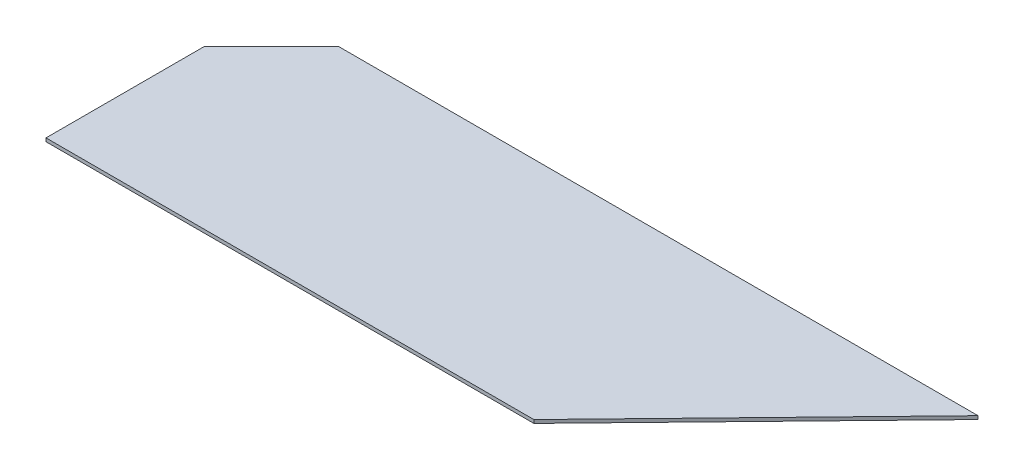
ISO-10303-21;
HEADER;
FILE_DESCRIPTION(('STEP AP214'),'2;1');
FILE_NAME('part.step','',(''),(''),'','','');
FILE_SCHEMA(('AUTOMOTIVE_DESIGN { 1 0 10303 214 1 1 1 1 }'));
ENDSEC;
DATA;
#1=APPLICATION_CONTEXT('core data for automotive mechanical design processes');
#2=APPLICATION_PROTOCOL_DEFINITION('international standard','automotive_design',2000,#1);
#3=PRODUCT_CONTEXT('',#1,'mechanical');
#4=PRODUCT('Part','Part','',(#3));
#5=PRODUCT_RELATED_PRODUCT_CATEGORY('part','',(#4));
#6=PRODUCT_DEFINITION_FORMATION('','',#4);
#7=PRODUCT_DEFINITION_CONTEXT('part definition',#1,'design');
#8=PRODUCT_DEFINITION('design','',#6,#7);
#9=PRODUCT_DEFINITION_SHAPE('','',#8);
#10=(LENGTH_UNIT() NAMED_UNIT(*) SI_UNIT(.MILLI.,.METRE.));
#11=(NAMED_UNIT(*) PLANE_ANGLE_UNIT() SI_UNIT($,.RADIAN.));
#12=(NAMED_UNIT(*) SI_UNIT($,.STERADIAN.) SOLID_ANGLE_UNIT());
#13=UNCERTAINTY_MEASURE_WITH_UNIT(LENGTH_MEASURE(1.E-05),#10,'distance_accuracy_value','');
#14=(GEOMETRIC_REPRESENTATION_CONTEXT(3) GLOBAL_UNCERTAINTY_ASSIGNED_CONTEXT((#13)) GLOBAL_UNIT_ASSIGNED_CONTEXT((#10,
#11,#12)) REPRESENTATION_CONTEXT('',''));
#15=CARTESIAN_POINT('',(0.,0.,0.));
#16=DIRECTION('',(0.,0.,1.));
#17=DIRECTION('',(1.,0.,0.));
#18=AXIS2_PLACEMENT_3D('',#15,#16,#17);
#19=CARTESIAN_POINT('',(-23.2086223984143,0.5,19.3808225966303));
#20=DIRECTION('',(1.,0.,0.));
#21=DIRECTION('',(0.,0.,-1.));
#22=AXIS2_PLACEMENT_3D('',#19,#20,#21);
#23=PLANE('',#22);
#24=DIRECTION('',(0.,0.,1.));
#25=VECTOR('',#24,1.);
#26=CARTESIAN_POINT('',(-23.2086223984143,0.,19.3808225966303));
#27=LINE('',#26,#25);
#28=CARTESIAN_POINT('',(-23.2086223984143,0.,-4.11917740336967));
#29=VERTEX_POINT('',#28);
#30=CARTESIAN_POINT('',(-23.2086223984143,0.,19.3808225966303));
#31=VERTEX_POINT('',#30);
#32=EDGE_CURVE('E109',#29,#31,#27,.T.);
#33=ORIENTED_EDGE('',*,*,#32,.T.);
#34=DIRECTION('',(0.,-1.,0.));
#35=VECTOR('',#34,1.);
#36=CARTESIAN_POINT('',(-23.2086223984143,0.5,19.3808225966303));
#37=LINE('',#36,#35);
#38=CARTESIAN_POINT('',(-23.2086223984143,0.5,19.3808225966303));
#39=VERTEX_POINT('',#38);
#40=EDGE_CURVE('E11',#39,#31,#37,.T.);
#41=ORIENTED_EDGE('',*,*,#40,.F.);
#42=DIRECTION('',(0.,0.,1.));
#43=VECTOR('',#42,1.);
#44=CARTESIAN_POINT('',(-23.2086223984143,0.5,19.3808225966303));
#45=LINE('',#44,#43);
#46=CARTESIAN_POINT('',(-23.2086223984143,0.5,-4.11917740336967));
#47=VERTEX_POINT('',#46);
#48=EDGE_CURVE('E117',#47,#39,#45,.T.);
#49=ORIENTED_EDGE('',*,*,#48,.F.);
#50=DIRECTION('',(0.,-1.,0.));
#51=VECTOR('',#50,1.);
#52=CARTESIAN_POINT('',(-23.2086223984143,0.5,-4.11917740336967));
#53=LINE('',#52,#51);
#54=EDGE_CURVE('E105',#47,#29,#53,.T.);
#55=ORIENTED_EDGE('',*,*,#54,.T.);
#56=EDGE_LOOP('',(#33,#41,#49,#55));
#57=FACE_BOUND('',#56,.T.);
#58=ADVANCED_FACE('F35',(#57),#23,.F.);
#59=CARTESIAN_POINT('',(-23.2086223984143,0.5,19.3808225966303));
#60=DIRECTION('',(0.,0.,-1.));
#61=DIRECTION('',(-1.,0.,0.));
#62=AXIS2_PLACEMENT_3D('',#59,#60,#61);
#63=PLANE('',#62);
#64=DIRECTION('',(1.,0.,0.));
#65=VECTOR('',#64,1.);
#66=CARTESIAN_POINT('',(-23.2086223984143,0.,19.3808225966303));
#67=LINE('',#66,#65);
#68=CARTESIAN_POINT('',(49.2913776015857,0.,19.3808225966303));
#69=VERTEX_POINT('',#68);
#70=EDGE_CURVE('E112',#31,#69,#67,.T.);
#71=ORIENTED_EDGE('',*,*,#70,.T.);
#72=DIRECTION('',(0.,-1.,0.));
#73=VECTOR('',#72,1.);
#74=CARTESIAN_POINT('',(49.2913776015857,0.5,19.3808225966303));
#75=LINE('',#74,#73);
#76=CARTESIAN_POINT('',(49.2913776015857,0.5,19.3808225966303));
#77=VERTEX_POINT('',#76);
#78=EDGE_CURVE('E43',#77,#69,#75,.T.);
#79=ORIENTED_EDGE('',*,*,#78,.F.);
#80=DIRECTION('',(1.,0.,0.));
#81=VECTOR('',#80,1.);
#82=CARTESIAN_POINT('',(-23.2086223984143,0.5,19.3808225966303));
#83=LINE('',#82,#81);
#84=EDGE_CURVE('E85',#39,#77,#83,.T.);
#85=ORIENTED_EDGE('',*,*,#84,.F.);
#86=ORIENTED_EDGE('',*,*,#40,.T.);
#87=EDGE_LOOP('',(#71,#79,#85,#86));
#88=FACE_BOUND('',#87,.T.);
#89=ADVANCED_FACE('F136',(#88),#63,.F.);
#90=CARTESIAN_POINT('',(49.2913776015857,0.5,19.3808225966303));
#91=DIRECTION('',(-0.717738140020842,0.,-0.696313120915743));
#92=DIRECTION('',(-0.696313120915743,0.,0.717738140020842));
#93=AXIS2_PLACEMENT_3D('',#90,#91,#92);
#94=PLANE('',#93);
#95=DIRECTION('',(0.696313120915743,0.,-0.717738140020842));
#96=VECTOR('',#95,1.);
#97=CARTESIAN_POINT('',(49.2913776015857,0.,19.3808225966303));
#98=LINE('',#97,#96);
#99=CARTESIAN_POINT('',(81.7913776015857,0.,-14.1191774033697));
#100=VERTEX_POINT('',#99);
#101=EDGE_CURVE('E100',#69,#100,#98,.T.);
#102=ORIENTED_EDGE('',*,*,#101,.T.);
#103=DIRECTION('',(0.,-1.,0.));
#104=VECTOR('',#103,1.);
#105=CARTESIAN_POINT('',(81.7913776015857,0.5,-14.1191774033697));
#106=LINE('',#105,#104);
#107=CARTESIAN_POINT('',(81.7913776015857,0.5,-14.1191774033697));
#108=VERTEX_POINT('',#107);
#109=EDGE_CURVE('E97',#108,#100,#106,.T.);
#110=ORIENTED_EDGE('',*,*,#109,.F.);
#111=DIRECTION('',(0.696313120915743,0.,-0.717738140020842));
#112=VECTOR('',#111,1.);
#113=CARTESIAN_POINT('',(49.2913776015857,0.5,19.3808225966303));
#114=LINE('',#113,#112);
#115=EDGE_CURVE('E89',#77,#108,#114,.T.);
#116=ORIENTED_EDGE('',*,*,#115,.F.);
#117=ORIENTED_EDGE('',*,*,#78,.T.);
#118=EDGE_LOOP('',(#102,#110,#116,#117));
#119=FACE_BOUND('',#118,.T.);
#120=ADVANCED_FACE('F98',(#119),#94,.F.);
#121=CARTESIAN_POINT('',(-13.2086223984143,0.5,-14.1191774033697));
#122=DIRECTION('',(0.,0.,1.));
#123=DIRECTION('',(1.,0.,0.));
#124=AXIS2_PLACEMENT_3D('',#121,#122,#123);
#125=PLANE('',#124);
#126=DIRECTION('',(-1.,0.,0.));
#127=VECTOR('',#126,1.);
#128=CARTESIAN_POINT('',(-13.2086223984143,0.,-14.1191774033697));
#129=LINE('',#128,#127);
#130=CARTESIAN_POINT('',(-13.2086223984143,0.,-14.1191774033697));
#131=VERTEX_POINT('',#130);
#132=EDGE_CURVE('E71',#100,#131,#129,.T.);
#133=ORIENTED_EDGE('',*,*,#132,.T.);
#134=DIRECTION('',(0.,-1.,0.));
#135=VECTOR('',#134,1.);
#136=CARTESIAN_POINT('',(-13.2086223984143,0.5,-14.1191774033697));
#137=LINE('',#136,#135);
#138=CARTESIAN_POINT('',(-13.2086223984143,0.5,-14.1191774033697));
#139=VERTEX_POINT('',#138);
#140=EDGE_CURVE('E101',#139,#131,#137,.T.);
#141=ORIENTED_EDGE('',*,*,#140,.F.);
#142=DIRECTION('',(-1.,0.,0.));
#143=VECTOR('',#142,1.);
#144=CARTESIAN_POINT('',(-13.2086223984143,0.5,-14.1191774033697));
#145=LINE('',#144,#143);
#146=EDGE_CURVE('E93',#108,#139,#145,.T.);
#147=ORIENTED_EDGE('',*,*,#146,.F.);
#148=ORIENTED_EDGE('',*,*,#109,.T.);
#149=EDGE_LOOP('',(#133,#141,#147,#148));
#150=FACE_BOUND('',#149,.T.);
#151=ADVANCED_FACE('F103',(#150),#125,.F.);
#152=CARTESIAN_POINT('',(-23.2086223984143,0.5,-4.11917740336967));
#153=DIRECTION('',(0.707106781186548,0.,0.707106781186547));
#154=DIRECTION('',(0.707106781186547,0.,-0.707106781186548));
#155=AXIS2_PLACEMENT_3D('',#152,#153,#154);
#156=PLANE('',#155);
#157=DIRECTION('',(-0.707106781186547,0.,0.707106781186548));
#158=VECTOR('',#157,1.);
#159=CARTESIAN_POINT('',(-23.2086223984143,0.,-4.11917740336967));
#160=LINE('',#159,#158);
#161=EDGE_CURVE('E77',#131,#29,#160,.T.);
#162=ORIENTED_EDGE('',*,*,#161,.T.);
#163=ORIENTED_EDGE('',*,*,#54,.F.);
#164=DIRECTION('',(-0.707106781186547,0.,0.707106781186548));
#165=VECTOR('',#164,1.);
#166=CARTESIAN_POINT('',(-23.2086223984143,0.5,-4.11917740336967));
#167=LINE('',#166,#165);
#168=EDGE_CURVE('E51',#139,#47,#167,.T.);
#169=ORIENTED_EDGE('',*,*,#168,.F.);
#170=ORIENTED_EDGE('',*,*,#140,.T.);
#171=EDGE_LOOP('',(#162,#163,#169,#170));
#172=FACE_BOUND('',#171,.T.);
#173=ADVANCED_FACE('F125',(#172),#156,.F.);
#174=CARTESIAN_POINT('',(0.,0.5,0.));
#175=DIRECTION('',(0.,-1.,0.));
#176=DIRECTION('',(0.,0.,-1.));
#177=AXIS2_PLACEMENT_3D('',#174,#175,#176);
#178=PLANE('',#177);
#179=ORIENTED_EDGE('',*,*,#48,.T.);
#180=ORIENTED_EDGE('',*,*,#84,.T.);
#181=ORIENTED_EDGE('',*,*,#115,.T.);
#182=ORIENTED_EDGE('',*,*,#146,.T.);
#183=ORIENTED_EDGE('',*,*,#168,.T.);
#184=EDGE_LOOP('',(#179,#180,#181,#182,#183));
#185=FACE_BOUND('',#184,.T.);
#186=ADVANCED_FACE('F91',(#185),#178,.F.);
#187=CARTESIAN_POINT('',(0.,0.,0.));
#188=DIRECTION('',(0.,-1.,0.));
#189=DIRECTION('',(0.,0.,-1.));
#190=AXIS2_PLACEMENT_3D('',#187,#188,#189);
#191=PLANE('',#190);
#192=ORIENTED_EDGE('',*,*,#32,.F.);
#193=ORIENTED_EDGE('',*,*,#161,.F.);
#194=ORIENTED_EDGE('',*,*,#132,.F.);
#195=ORIENTED_EDGE('',*,*,#101,.F.);
#196=ORIENTED_EDGE('',*,*,#70,.F.);
#197=EDGE_LOOP('',(#192,#193,#194,#195,#196));
#198=FACE_BOUND('',#197,.T.);
#199=ADVANCED_FACE('F121',(#198),#191,.T.);
#200=CLOSED_SHELL('',(#58,#89,#120,#151,#173,#186,#199));
#201=MANIFOLD_SOLID_BREP('B2',#200);
#202=ADVANCED_BREP_SHAPE_REPRESENTATION('',(#18,#201),#14);
#203=SHAPE_DEFINITION_REPRESENTATION(#9,#202);
ENDSEC;
END-ISO-10303-21;
